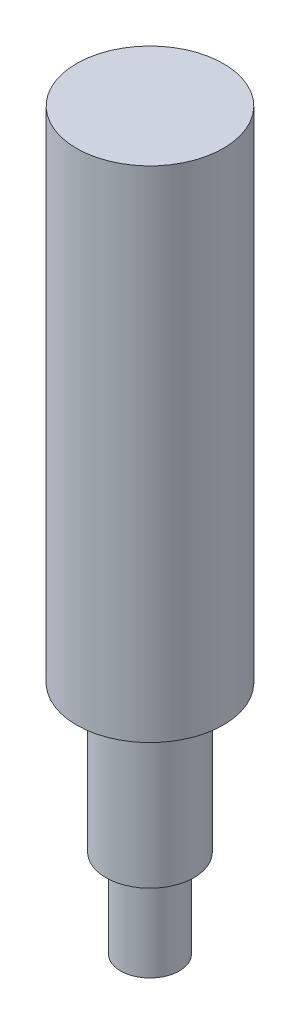
ISO-10303-21;
HEADER;
FILE_DESCRIPTION(('STEP AP214'),'2;1');
FILE_NAME('part.step','',(''),(''),'','','');
FILE_SCHEMA(('AUTOMOTIVE_DESIGN { 1 0 10303 214 1 1 1 1 }'));
ENDSEC;
DATA;
#1=APPLICATION_CONTEXT('core data for automotive mechanical design processes');
#2=APPLICATION_PROTOCOL_DEFINITION('international standard','automotive_design',2000,#1);
#3=PRODUCT_CONTEXT('',#1,'mechanical');
#4=PRODUCT('Part','Part','',(#3));
#5=PRODUCT_RELATED_PRODUCT_CATEGORY('part','',(#4));
#6=PRODUCT_DEFINITION_FORMATION('','',#4);
#7=PRODUCT_DEFINITION_CONTEXT('part definition',#1,'design');
#8=PRODUCT_DEFINITION('design','',#6,#7);
#9=PRODUCT_DEFINITION_SHAPE('','',#8);
#10=(LENGTH_UNIT() NAMED_UNIT(*) SI_UNIT(.MILLI.,.METRE.));
#11=(NAMED_UNIT(*) PLANE_ANGLE_UNIT() SI_UNIT($,.RADIAN.));
#12=(NAMED_UNIT(*) SI_UNIT($,.STERADIAN.) SOLID_ANGLE_UNIT());
#13=UNCERTAINTY_MEASURE_WITH_UNIT(LENGTH_MEASURE(1.E-05),#10,'distance_accuracy_value','');
#14=(GEOMETRIC_REPRESENTATION_CONTEXT(3) GLOBAL_UNCERTAINTY_ASSIGNED_CONTEXT((#13)) GLOBAL_UNIT_ASSIGNED_CONTEXT((#10,
#11,#12)) REPRESENTATION_CONTEXT('',''));
#15=CARTESIAN_POINT('',(0.,0.,0.));
#16=DIRECTION('',(0.,0.,1.));
#17=DIRECTION('',(1.,0.,0.));
#18=AXIS2_PLACEMENT_3D('',#15,#16,#17);
#19=CARTESIAN_POINT('',(-20.2916512459885,-134.,0.));
#20=DIRECTION('',(0.,-1.,0.));
#21=DIRECTION('',(0.,0.,-1.));
#22=AXIS2_PLACEMENT_3D('',#19,#20,#21);
#23=CYLINDRICAL_SURFACE('',#22,2.);
#24=CARTESIAN_POINT('',(-20.2916512459885,-134.,0.));
#25=DIRECTION('',(0.,1.,0.));
#26=DIRECTION('',(0.,0.,1.));
#27=AXIS2_PLACEMENT_3D('',#24,#25,#26);
#28=CIRCLE('',#27,2.);
#29=CARTESIAN_POINT('',(-20.2916512459885,-134.,2.));
#30=VERTEX_POINT('',#29);
#31=EDGE_CURVE('E10',#30,#30,#28,.T.);
#32=ORIENTED_EDGE('',*,*,#31,.F.);
#33=EDGE_LOOP('',(#32));
#34=FACE_BOUND('',#33,.T.);
#35=CARTESIAN_POINT('',(-20.2916512459885,-140.,0.));
#36=DIRECTION('',(0.,1.,0.));
#37=DIRECTION('',(0.,0.,1.));
#38=AXIS2_PLACEMENT_3D('',#35,#36,#37);
#39=CIRCLE('',#38,2.);
#40=CARTESIAN_POINT('',(-20.2916512459885,-140.,2.));
#41=VERTEX_POINT('',#40);
#42=EDGE_CURVE('E37',#41,#41,#39,.T.);
#43=ORIENTED_EDGE('',*,*,#42,.T.);
#44=EDGE_LOOP('',(#43));
#45=FACE_BOUND('',#44,.T.);
#46=ADVANCED_FACE('F40',(#34,#45),#23,.T.);
#47=CARTESIAN_POINT('',(-20.2916512459885,-140.,0.));
#48=DIRECTION('',(0.,1.,0.));
#49=DIRECTION('',(0.,0.,1.));
#50=AXIS2_PLACEMENT_3D('',#47,#48,#49);
#51=PLANE('',#50);
#52=ORIENTED_EDGE('',*,*,#42,.F.);
#53=EDGE_LOOP('',(#52));
#54=FACE_BOUND('',#53,.T.);
#55=ADVANCED_FACE('F78',(#54),#51,.F.);
#56=CARTESIAN_POINT('',(-20.2916512459885,-124.,0.));
#57=DIRECTION('',(0.,-1.,0.));
#58=DIRECTION('',(0.,0.,-1.));
#59=AXIS2_PLACEMENT_3D('',#56,#57,#58);
#60=CYLINDRICAL_SURFACE('',#59,3.);
#61=CARTESIAN_POINT('',(-20.2916512459885,-124.,0.));
#62=DIRECTION('',(0.,1.,0.));
#63=DIRECTION('',(0.,0.,1.));
#64=AXIS2_PLACEMENT_3D('',#61,#62,#63);
#65=CIRCLE('',#64,3.);
#66=CARTESIAN_POINT('',(-20.2916512459885,-124.,3.));
#67=VERTEX_POINT('',#66);
#68=EDGE_CURVE('E50',#67,#67,#65,.T.);
#69=ORIENTED_EDGE('',*,*,#68,.F.);
#70=EDGE_LOOP('',(#69));
#71=FACE_BOUND('',#70,.T.);
#72=CARTESIAN_POINT('',(-20.2916512459885,-134.,0.));
#73=DIRECTION('',(0.,1.,0.));
#74=DIRECTION('',(0.,0.,1.));
#75=AXIS2_PLACEMENT_3D('',#72,#73,#74);
#76=CIRCLE('',#75,3.);
#77=CARTESIAN_POINT('',(-20.2916512459885,-134.,3.));
#78=VERTEX_POINT('',#77);
#79=EDGE_CURVE('E47',#78,#78,#76,.T.);
#80=ORIENTED_EDGE('',*,*,#79,.T.);
#81=EDGE_LOOP('',(#80));
#82=FACE_BOUND('',#81,.T.);
#83=ADVANCED_FACE('F84',(#71,#82),#60,.T.);
#84=CARTESIAN_POINT('',(-20.2916512459885,-134.,0.));
#85=DIRECTION('',(0.,1.,0.));
#86=DIRECTION('',(0.,0.,1.));
#87=AXIS2_PLACEMENT_3D('',#84,#85,#86);
#88=PLANE('',#87);
#89=ORIENTED_EDGE('',*,*,#31,.T.);
#90=EDGE_LOOP('',(#89));
#91=FACE_BOUND('',#90,.T.);
#92=ORIENTED_EDGE('',*,*,#79,.F.);
#93=EDGE_LOOP('',(#92));
#94=FACE_BOUND('',#93,.T.);
#95=ADVANCED_FACE('F67',(#91,#94),#88,.F.);
#96=CARTESIAN_POINT('',(-20.2916512459885,-90.,0.));
#97=DIRECTION('',(0.,-1.,0.));
#98=DIRECTION('',(0.,0.,-1.));
#99=AXIS2_PLACEMENT_3D('',#96,#97,#98);
#100=CYLINDRICAL_SURFACE('',#99,5.);
#101=CARTESIAN_POINT('',(-20.2916512459885,-90.,0.));
#102=DIRECTION('',(0.,1.,0.));
#103=DIRECTION('',(0.,0.,1.));
#104=AXIS2_PLACEMENT_3D('',#101,#102,#103);
#105=CIRCLE('',#104,5.);
#106=CARTESIAN_POINT('',(-20.2916512459885,-90.,5.));
#107=VERTEX_POINT('',#106);
#108=EDGE_CURVE('E55',#107,#107,#105,.T.);
#109=ORIENTED_EDGE('',*,*,#108,.F.);
#110=EDGE_LOOP('',(#109));
#111=FACE_BOUND('',#110,.T.);
#112=CARTESIAN_POINT('',(-20.2916512459885,-124.,0.));
#113=DIRECTION('',(0.,1.,0.));
#114=DIRECTION('',(0.,0.,1.));
#115=AXIS2_PLACEMENT_3D('',#112,#113,#114);
#116=CIRCLE('',#115,5.);
#117=CARTESIAN_POINT('',(-20.2916512459885,-124.,5.));
#118=VERTEX_POINT('',#117);
#119=EDGE_CURVE('E54',#118,#118,#116,.T.);
#120=ORIENTED_EDGE('',*,*,#119,.T.);
#121=EDGE_LOOP('',(#120));
#122=FACE_BOUND('',#121,.T.);
#123=ADVANCED_FACE('F64',(#111,#122),#100,.T.);
#124=CARTESIAN_POINT('',(-20.2916512459885,-90.,0.));
#125=DIRECTION('',(0.,1.,0.));
#126=DIRECTION('',(0.,0.,1.));
#127=AXIS2_PLACEMENT_3D('',#124,#125,#126);
#128=PLANE('',#127);
#129=ORIENTED_EDGE('',*,*,#108,.T.);
#130=EDGE_LOOP('',(#129));
#131=FACE_BOUND('',#130,.T.);
#132=ADVANCED_FACE('F61',(#131),#128,.T.);
#133=CARTESIAN_POINT('',(-20.2916512459885,-124.,0.));
#134=DIRECTION('',(0.,1.,0.));
#135=DIRECTION('',(0.,0.,1.));
#136=AXIS2_PLACEMENT_3D('',#133,#134,#135);
#137=PLANE('',#136);
#138=ORIENTED_EDGE('',*,*,#68,.T.);
#139=EDGE_LOOP('',(#138));
#140=FACE_BOUND('',#139,.T.);
#141=ORIENTED_EDGE('',*,*,#119,.F.);
#142=EDGE_LOOP('',(#141));
#143=FACE_BOUND('',#142,.T.);
#144=ADVANCED_FACE('F66',(#140,#143),#137,.F.);
#145=CLOSED_SHELL('',(#46,#55,#83,#95,#123,#132,#144));
#146=MANIFOLD_SOLID_BREP('B2',#145);
#147=ADVANCED_BREP_SHAPE_REPRESENTATION('',(#18,#146),#14);
#148=SHAPE_DEFINITION_REPRESENTATION(#9,#147);
ENDSEC;
END-ISO-10303-21;
